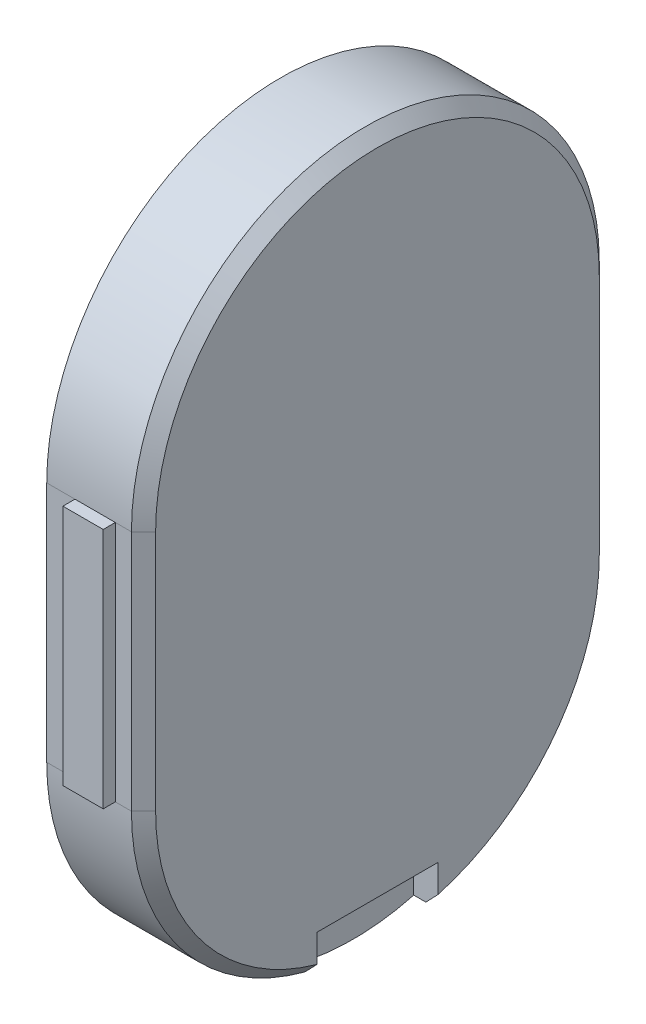
ISO-10303-21;
HEADER;
FILE_DESCRIPTION(('STEP AP214'),'2;1');
FILE_NAME('part.step','',(''),(''),'','','');
FILE_SCHEMA(('AUTOMOTIVE_DESIGN { 1 0 10303 214 1 1 1 1 }'));
ENDSEC;
DATA;
#1=APPLICATION_CONTEXT('core data for automotive mechanical design processes');
#2=APPLICATION_PROTOCOL_DEFINITION('international standard','automotive_design',2000,#1);
#3=PRODUCT_CONTEXT('',#1,'mechanical');
#4=PRODUCT('Part','Part','',(#3));
#5=PRODUCT_RELATED_PRODUCT_CATEGORY('part','',(#4));
#6=PRODUCT_DEFINITION_FORMATION('','',#4);
#7=PRODUCT_DEFINITION_CONTEXT('part definition',#1,'design');
#8=PRODUCT_DEFINITION('design','',#6,#7);
#9=PRODUCT_DEFINITION_SHAPE('','',#8);
#10=(LENGTH_UNIT() NAMED_UNIT(*) SI_UNIT(.MILLI.,.METRE.));
#11=(NAMED_UNIT(*) PLANE_ANGLE_UNIT() SI_UNIT($,.RADIAN.));
#12=(NAMED_UNIT(*) SI_UNIT($,.STERADIAN.) SOLID_ANGLE_UNIT());
#13=UNCERTAINTY_MEASURE_WITH_UNIT(LENGTH_MEASURE(1.E-05),#10,'distance_accuracy_value','');
#14=(GEOMETRIC_REPRESENTATION_CONTEXT(3) GLOBAL_UNCERTAINTY_ASSIGNED_CONTEXT((#13)) GLOBAL_UNIT_ASSIGNED_CONTEXT((#10,
#11,#12)) REPRESENTATION_CONTEXT('',''));
#15=CARTESIAN_POINT('',(0.,0.,0.));
#16=DIRECTION('',(0.,0.,1.));
#17=DIRECTION('',(1.,0.,0.));
#18=AXIS2_PLACEMENT_3D('',#15,#16,#17);
#19=CARTESIAN_POINT('',(63.,110.,67.4));
#20=DIRECTION('',(-1.,0.,0.));
#21=DIRECTION('',(0.,0.,1.));
#22=AXIS2_PLACEMENT_3D('',#19,#20,#21);
#23=CYLINDRICAL_SURFACE('',#22,5.8);
#24=DIRECTION('',(-1.,0.,0.));
#25=VECTOR('',#24,1.);
#26=CARTESIAN_POINT('',(63.,104.397322068867,68.9));
#27=LINE('',#26,#25);
#28=CARTESIAN_POINT('',(62.7,104.397322068867,68.9));
#29=VERTEX_POINT('',#28);
#30=CARTESIAN_POINT('',(62.4,104.397322068867,68.9));
#31=VERTEX_POINT('',#30);
#32=EDGE_CURVE('E205',#29,#31,#27,.T.);
#33=ORIENTED_EDGE('',*,*,#32,.F.);
#34=CARTESIAN_POINT('',(62.7,110.,67.4));
#35=DIRECTION('',(-1.,0.,0.));
#36=DIRECTION('',(0.,0.,1.));
#37=AXIS2_PLACEMENT_3D('',#34,#35,#36);
#38=CIRCLE('',#37,5.8);
#39=CARTESIAN_POINT('',(62.7,110.,73.2));
#40=VERTEX_POINT('',#39);
#41=EDGE_CURVE('E349',#29,#40,#38,.T.);
#42=ORIENTED_EDGE('',*,*,#41,.T.);
#43=DIRECTION('',(-1.,0.,0.));
#44=VECTOR('',#43,1.);
#45=CARTESIAN_POINT('',(63.,110.,73.2));
#46=LINE('',#45,#44);
#47=CARTESIAN_POINT('',(62.3,110.,73.2));
#48=VERTEX_POINT('',#47);
#49=EDGE_CURVE('E312',#40,#48,#46,.T.);
#50=ORIENTED_EDGE('',*,*,#49,.T.);
#51=CARTESIAN_POINT('',(61.3,110.,73.2));
#52=VERTEX_POINT('',#51);
#53=EDGE_CURVE('E317',#48,#52,#46,.T.);
#54=ORIENTED_EDGE('',*,*,#53,.T.);
#55=CARTESIAN_POINT('',(60.6,110.,73.2));
#56=VERTEX_POINT('',#55);
#57=EDGE_CURVE('E311',#52,#56,#46,.T.);
#58=ORIENTED_EDGE('',*,*,#57,.T.);
#59=CARTESIAN_POINT('',(60.6,110.,67.4));
#60=DIRECTION('',(1.,0.,0.));
#61=DIRECTION('',(0.,0.,1.));
#62=AXIS2_PLACEMENT_3D('',#59,#60,#61);
#63=CIRCLE('',#62,5.8);
#64=CARTESIAN_POINT('',(60.6,110.,61.6));
#65=VERTEX_POINT('',#64);
#66=EDGE_CURVE('E307',#56,#65,#63,.T.);
#67=ORIENTED_EDGE('',*,*,#66,.T.);
#68=DIRECTION('',(-1.,0.,0.));
#69=VECTOR('',#68,1.);
#70=CARTESIAN_POINT('',(63.,110.,61.6));
#71=LINE('',#70,#69);
#72=CARTESIAN_POINT('',(61.3,110.,61.6));
#73=VERTEX_POINT('',#72);
#74=EDGE_CURVE('E328',#73,#65,#71,.T.);
#75=ORIENTED_EDGE('',*,*,#74,.F.);
#76=CARTESIAN_POINT('',(62.3,110.,61.6));
#77=VERTEX_POINT('',#76);
#78=EDGE_CURVE('E335',#77,#73,#71,.T.);
#79=ORIENTED_EDGE('',*,*,#78,.F.);
#80=CARTESIAN_POINT('',(62.7,110.,61.6));
#81=VERTEX_POINT('',#80);
#82=EDGE_CURVE('E330',#81,#77,#71,.T.);
#83=ORIENTED_EDGE('',*,*,#82,.F.);
#84=CARTESIAN_POINT('',(62.7,104.397322068867,65.9));
#85=VERTEX_POINT('',#84);
#86=EDGE_CURVE('E350',#81,#85,#38,.T.);
#87=ORIENTED_EDGE('',*,*,#86,.T.);
#88=DIRECTION('',(-1.,0.,0.));
#89=VECTOR('',#88,1.);
#90=CARTESIAN_POINT('',(63.,104.397322068867,65.9));
#91=LINE('',#90,#89);
#92=CARTESIAN_POINT('',(62.4,104.397322068867,65.9));
#93=VERTEX_POINT('',#92);
#94=EDGE_CURVE('E66',#85,#93,#91,.T.);
#95=ORIENTED_EDGE('',*,*,#94,.T.);
#96=CARTESIAN_POINT('',(62.4,110.,67.4));
#97=DIRECTION('',(1.,0.,0.));
#98=DIRECTION('',(0.,0.,-1.));
#99=AXIS2_PLACEMENT_3D('',#96,#97,#98);
#100=CIRCLE('',#99,5.8);
#101=EDGE_CURVE('E11',#31,#93,#100,.T.);
#102=ORIENTED_EDGE('',*,*,#101,.F.);
#103=EDGE_LOOP('',(#33,#42,#50,#54,#58,#67,#75,#79,#83,#87,#95,#102));
#104=FACE_BOUND('',#103,.T.);
#105=ADVANCED_FACE('F49',(#104),#23,.T.);
#106=CARTESIAN_POINT('',(63.,110.,67.4));
#107=DIRECTION('',(-1.,0.,0.));
#108=DIRECTION('',(0.,0.,1.));
#109=AXIS2_PLACEMENT_3D('',#106,#107,#108);
#110=PLANE('',#109);
#111=DIRECTION('',(0.,-1.,0.));
#112=VECTOR('',#111,1.);
#113=CARTESIAN_POINT('',(63.,110.,68.9));
#114=LINE('',#113,#112);
#115=CARTESIAN_POINT('',(63.,105.4,68.9));
#116=VERTEX_POINT('',#115);
#117=CARTESIAN_POINT('',(63.,104.708497377871,68.9));
#118=VERTEX_POINT('',#117);
#119=EDGE_CURVE('E219',#116,#118,#114,.T.);
#120=ORIENTED_EDGE('',*,*,#119,.F.);
#121=DIRECTION('',(0.,0.,1.));
#122=VECTOR('',#121,1.);
#123=CARTESIAN_POINT('',(63.,105.4,67.4));
#124=LINE('',#123,#122);
#125=CARTESIAN_POINT('',(63.,105.4,65.9));
#126=VERTEX_POINT('',#125);
#127=EDGE_CURVE('E59',#126,#116,#124,.T.);
#128=ORIENTED_EDGE('',*,*,#127,.F.);
#129=DIRECTION('',(0.,-1.,0.));
#130=VECTOR('',#129,1.);
#131=CARTESIAN_POINT('',(63.,110.,65.9));
#132=LINE('',#131,#130);
#133=CARTESIAN_POINT('',(63.,104.708497377871,65.9));
#134=VERTEX_POINT('',#133);
#135=EDGE_CURVE('E201',#126,#134,#132,.T.);
#136=ORIENTED_EDGE('',*,*,#135,.T.);
#137=CARTESIAN_POINT('',(63.,110.,67.4));
#138=DIRECTION('',(-1.,0.,0.));
#139=DIRECTION('',(0.,0.,1.));
#140=AXIS2_PLACEMENT_3D('',#137,#138,#139);
#141=CIRCLE('',#140,5.49999999999999);
#142=CARTESIAN_POINT('',(63.,110.,61.9));
#143=VERTEX_POINT('',#142);
#144=EDGE_CURVE('E344',#134,#143,#141,.F.);
#145=ORIENTED_EDGE('',*,*,#144,.T.);
#146=DIRECTION('',(0.,1.,0.));
#147=VECTOR('',#146,1.);
#148=CARTESIAN_POINT('',(63.,110.,61.9));
#149=LINE('',#148,#147);
#150=CARTESIAN_POINT('',(63.,116.,61.9));
#151=VERTEX_POINT('',#150);
#152=EDGE_CURVE('E341',#143,#151,#149,.T.);
#153=ORIENTED_EDGE('',*,*,#152,.T.);
#154=CARTESIAN_POINT('',(63.,116.,67.4));
#155=DIRECTION('',(-1.,0.,0.));
#156=DIRECTION('',(0.,0.,1.));
#157=AXIS2_PLACEMENT_3D('',#154,#155,#156);
#158=CIRCLE('',#157,5.49999999999999);
#159=CARTESIAN_POINT('',(63.,116.,72.9));
#160=VERTEX_POINT('',#159);
#161=EDGE_CURVE('E334',#151,#160,#158,.F.);
#162=ORIENTED_EDGE('',*,*,#161,.T.);
#163=DIRECTION('',(0.,-1.,0.));
#164=VECTOR('',#163,1.);
#165=CARTESIAN_POINT('',(63.,110.,72.9));
#166=LINE('',#165,#164);
#167=CARTESIAN_POINT('',(63.,110.,72.9));
#168=VERTEX_POINT('',#167);
#169=EDGE_CURVE('E338',#160,#168,#166,.T.);
#170=ORIENTED_EDGE('',*,*,#169,.T.);
#171=EDGE_CURVE('E345',#168,#118,#141,.F.);
#172=ORIENTED_EDGE('',*,*,#171,.T.);
#173=EDGE_LOOP('',(#120,#128,#136,#145,#153,#162,#170,#172));
#174=FACE_BOUND('',#173,.T.);
#175=ADVANCED_FACE('F445',(#174),#110,.F.);
#176=CARTESIAN_POINT('',(63.,110.,67.4));
#177=DIRECTION('',(-1.,0.,0.));
#178=DIRECTION('',(0.,0.,1.));
#179=AXIS2_PLACEMENT_3D('',#176,#177,#178);
#180=CONICAL_SURFACE('',#179,5.49999999999999,0.785398163397448);
#181=ORIENTED_EDGE('',*,*,#41,.F.);
#182=CARTESIAN_POINT('',(61.4628683123147,103.124592929155,68.9));
#183=CARTESIAN_POINT('',(61.6959494424737,103.363197804304,68.9));
#184=CARTESIAN_POINT('',(61.9287883147822,103.602040927902,68.9));
#185=CARTESIAN_POINT('',(62.3936696597395,104.080488885385,68.9));
#186=CARTESIAN_POINT('',(62.6257121524155,104.320093699818,68.9));
#187=CARTESIAN_POINT('',(63.0887046335069,104.800366398064,68.9));
#188=CARTESIAN_POINT('',(63.3196546032696,105.041034299892,68.9));
#189=CARTESIAN_POINT('',(63.6648267390506,105.403236485253,68.9));
#190=CARTESIAN_POINT('',(63.7796767548246,105.524172135007,68.9));
#191=CARTESIAN_POINT('',(64.0088383775944,105.766553873108,68.9));
#192=CARTESIAN_POINT('',(64.1231499809189,105.887999964926,68.9));
#193=CARTESIAN_POINT('',(64.2371316876853,106.00975611671,68.9));
#194=B_SPLINE_CURVE_WITH_KNOTS('',3,(#182,#183,#184,#185,#186,#187,#188,#189,#190,#191,#192,
#193),.UNSPECIFIED.,.F.,.F.,(4,2,2,2,2,4),(0.,1.00066718336188,2.00130901489094,
3.00196786925576,3.50230991491606,4.00265536751893),.UNSPECIFIED.);
#195=EDGE_CURVE('E386',#29,#118,#194,.T.);
#196=ORIENTED_EDGE('',*,*,#195,.T.);
#197=ORIENTED_EDGE('',*,*,#171,.F.);
#198=DIRECTION('',(-0.707106781186547,0.,0.707106781186547));
#199=VECTOR('',#198,1.);
#200=CARTESIAN_POINT('',(63.,110.,72.9));
#201=LINE('',#200,#199);
#202=EDGE_CURVE('E367',#168,#40,#201,.T.);
#203=ORIENTED_EDGE('',*,*,#202,.T.);
#204=EDGE_LOOP('',(#181,#196,#197,#203));
#205=FACE_BOUND('',#204,.T.);
#206=ADVANCED_FACE('F448',(#205),#180,.T.);
#207=CARTESIAN_POINT('',(63.,110.,73.2));
#208=DIRECTION('',(0.,0.,-1.));
#209=DIRECTION('',(-1.,0.,0.));
#210=AXIS2_PLACEMENT_3D('',#207,#208,#209);
#211=PLANE('',#210);
#212=DIRECTION('',(0.,-1.,0.));
#213=VECTOR('',#212,1.);
#214=CARTESIAN_POINT('',(61.3,110.,73.2));
#215=LINE('',#214,#213);
#216=CARTESIAN_POINT('',(61.3,116.,73.2));
#217=VERTEX_POINT('',#216);
#218=EDGE_CURVE('E254',#217,#52,#215,.T.);
#219=ORIENTED_EDGE('',*,*,#218,.F.);
#220=DIRECTION('',(-1.,0.,0.));
#221=VECTOR('',#220,1.);
#222=CARTESIAN_POINT('',(63.,116.,73.2));
#223=LINE('',#222,#221);
#224=CARTESIAN_POINT('',(60.6,116.,73.2));
#225=VERTEX_POINT('',#224);
#226=EDGE_CURVE('E316',#217,#225,#223,.T.);
#227=ORIENTED_EDGE('',*,*,#226,.T.);
#228=DIRECTION('',(0.,-1.,0.));
#229=VECTOR('',#228,1.);
#230=CARTESIAN_POINT('',(60.6,110.,73.2));
#231=LINE('',#230,#229);
#232=EDGE_CURVE('E303',#225,#56,#231,.T.);
#233=ORIENTED_EDGE('',*,*,#232,.T.);
#234=ORIENTED_EDGE('',*,*,#57,.F.);
#235=EDGE_LOOP('',(#219,#227,#233,#234));
#236=FACE_BOUND('',#235,.T.);
#237=ADVANCED_FACE('F458',(#236),#211,.F.);
#238=DIRECTION('',(0.,1.,0.));
#239=VECTOR('',#238,1.);
#240=CARTESIAN_POINT('',(62.3,110.,73.2));
#241=LINE('',#240,#239);
#242=CARTESIAN_POINT('',(62.3,116.,73.2));
#243=VERTEX_POINT('',#242);
#244=EDGE_CURVE('E251',#48,#243,#241,.T.);
#245=ORIENTED_EDGE('',*,*,#244,.F.);
#246=ORIENTED_EDGE('',*,*,#49,.F.);
#247=DIRECTION('',(0.,1.,0.));
#248=VECTOR('',#247,1.);
#249=CARTESIAN_POINT('',(62.7,110.,73.2));
#250=LINE('',#249,#248);
#251=CARTESIAN_POINT('',(62.7,116.,73.2));
#252=VERTEX_POINT('',#251);
#253=EDGE_CURVE('E357',#40,#252,#250,.T.);
#254=ORIENTED_EDGE('',*,*,#253,.T.);
#255=EDGE_CURVE('E318',#252,#243,#223,.T.);
#256=ORIENTED_EDGE('',*,*,#255,.T.);
#257=EDGE_LOOP('',(#245,#246,#254,#256));
#258=FACE_BOUND('',#257,.T.);
#259=ADVANCED_FACE('F461',(#258),#211,.F.);
#260=CARTESIAN_POINT('',(63.,116.,61.6));
#261=DIRECTION('',(0.,0.,1.));
#262=DIRECTION('',(1.,0.,0.));
#263=AXIS2_PLACEMENT_3D('',#260,#261,#262);
#264=PLANE('',#263);
#265=DIRECTION('',(0.,1.,0.));
#266=VECTOR('',#265,1.);
#267=CARTESIAN_POINT('',(61.3,116.,61.6));
#268=LINE('',#267,#266);
#269=CARTESIAN_POINT('',(61.3,116.,61.6));
#270=VERTEX_POINT('',#269);
#271=EDGE_CURVE('E289',#73,#270,#268,.T.);
#272=ORIENTED_EDGE('',*,*,#271,.F.);
#273=ORIENTED_EDGE('',*,*,#74,.T.);
#274=DIRECTION('',(0.,1.,0.));
#275=VECTOR('',#274,1.);
#276=CARTESIAN_POINT('',(60.6,116.,61.6));
#277=LINE('',#276,#275);
#278=CARTESIAN_POINT('',(60.6,116.,61.6));
#279=VERTEX_POINT('',#278);
#280=EDGE_CURVE('E294',#65,#279,#277,.T.);
#281=ORIENTED_EDGE('',*,*,#280,.T.);
#282=DIRECTION('',(-1.,0.,0.));
#283=VECTOR('',#282,1.);
#284=CARTESIAN_POINT('',(63.,116.,61.6));
#285=LINE('',#284,#283);
#286=EDGE_CURVE('E322',#270,#279,#285,.T.);
#287=ORIENTED_EDGE('',*,*,#286,.F.);
#288=EDGE_LOOP('',(#272,#273,#281,#287));
#289=FACE_BOUND('',#288,.T.);
#290=ADVANCED_FACE('F466',(#289),#264,.F.);
#291=DIRECTION('',(0.,-1.,0.));
#292=VECTOR('',#291,1.);
#293=CARTESIAN_POINT('',(62.3,116.,61.6));
#294=LINE('',#293,#292);
#295=CARTESIAN_POINT('',(62.3,116.,61.6));
#296=VERTEX_POINT('',#295);
#297=EDGE_CURVE('E285',#296,#77,#294,.T.);
#298=ORIENTED_EDGE('',*,*,#297,.F.);
#299=CARTESIAN_POINT('',(62.7,116.,61.6));
#300=VERTEX_POINT('',#299);
#301=EDGE_CURVE('E324',#300,#296,#285,.T.);
#302=ORIENTED_EDGE('',*,*,#301,.F.);
#303=DIRECTION('',(0.,-1.,0.));
#304=VECTOR('',#303,1.);
#305=CARTESIAN_POINT('',(62.7,116.,61.6));
#306=LINE('',#305,#304);
#307=EDGE_CURVE('E354',#300,#81,#306,.T.);
#308=ORIENTED_EDGE('',*,*,#307,.T.);
#309=ORIENTED_EDGE('',*,*,#82,.T.);
#310=EDGE_LOOP('',(#298,#302,#308,#309));
#311=FACE_BOUND('',#310,.T.);
#312=ADVANCED_FACE('F464',(#311),#264,.F.);
#313=CARTESIAN_POINT('',(63.,116.,67.4));
#314=DIRECTION('',(-1.,0.,0.));
#315=DIRECTION('',(0.,0.,1.));
#316=AXIS2_PLACEMENT_3D('',#313,#314,#315);
#317=CYLINDRICAL_SURFACE('',#316,5.8);
#318=ORIENTED_EDGE('',*,*,#255,.F.);
#319=CARTESIAN_POINT('',(62.7,116.,67.4));
#320=DIRECTION('',(-1.,0.,0.));
#321=DIRECTION('',(0.,0.,1.));
#322=AXIS2_PLACEMENT_3D('',#319,#320,#321);
#323=CIRCLE('',#322,5.8);
#324=EDGE_CURVE('E360',#252,#300,#323,.T.);
#325=ORIENTED_EDGE('',*,*,#324,.T.);
#326=ORIENTED_EDGE('',*,*,#301,.T.);
#327=EDGE_CURVE('E329',#296,#270,#285,.T.);
#328=ORIENTED_EDGE('',*,*,#327,.T.);
#329=ORIENTED_EDGE('',*,*,#286,.T.);
#330=CARTESIAN_POINT('',(60.6,116.,67.4));
#331=DIRECTION('',(1.,0.,0.));
#332=DIRECTION('',(0.,0.,1.));
#333=AXIS2_PLACEMENT_3D('',#330,#331,#332);
#334=CIRCLE('',#333,5.8);
#335=EDGE_CURVE('E298',#279,#225,#334,.T.);
#336=ORIENTED_EDGE('',*,*,#335,.T.);
#337=ORIENTED_EDGE('',*,*,#226,.F.);
#338=EDGE_CURVE('E323',#243,#217,#223,.T.);
#339=ORIENTED_EDGE('',*,*,#338,.F.);
#340=EDGE_LOOP('',(#318,#325,#326,#328,#329,#336,#337,#339));
#341=FACE_BOUND('',#340,.T.);
#342=ADVANCED_FACE('F453',(#341),#317,.T.);
#343=CARTESIAN_POINT('',(60.6,110.,67.4));
#344=DIRECTION('',(-1.,0.,0.));
#345=DIRECTION('',(0.,0.,1.));
#346=AXIS2_PLACEMENT_3D('',#343,#344,#345);
#347=PLANE('',#346);
#348=ORIENTED_EDGE('',*,*,#280,.F.);
#349=ORIENTED_EDGE('',*,*,#66,.F.);
#350=ORIENTED_EDGE('',*,*,#232,.F.);
#351=ORIENTED_EDGE('',*,*,#335,.F.);
#352=EDGE_LOOP('',(#348,#349,#350,#351));
#353=FACE_BOUND('',#352,.T.);
#354=ADVANCED_FACE('F450',(#353),#347,.T.);
#355=CARTESIAN_POINT('',(63.,116.,67.4));
#356=DIRECTION('',(-1.,0.,0.));
#357=DIRECTION('',(0.,0.,1.));
#358=AXIS2_PLACEMENT_3D('',#355,#356,#357);
#359=CONICAL_SURFACE('',#358,5.49999999999999,0.785398163397448);
#360=DIRECTION('',(0.707106781186547,0.,0.707106781186547));
#361=VECTOR('',#360,1.);
#362=CARTESIAN_POINT('',(62.7,116.,61.6));
#363=LINE('',#362,#361);
#364=EDGE_CURVE('E371',#300,#151,#363,.T.);
#365=ORIENTED_EDGE('',*,*,#364,.F.);
#366=ORIENTED_EDGE('',*,*,#324,.F.);
#367=DIRECTION('',(-0.707106781186547,0.,0.707106781186547));
#368=VECTOR('',#367,1.);
#369=CARTESIAN_POINT('',(63.,116.,72.9));
#370=LINE('',#369,#368);
#371=EDGE_CURVE('E299',#160,#252,#370,.T.);
#372=ORIENTED_EDGE('',*,*,#371,.F.);
#373=ORIENTED_EDGE('',*,*,#161,.F.);
#374=EDGE_LOOP('',(#365,#366,#372,#373));
#375=FACE_BOUND('',#374,.T.);
#376=ADVANCED_FACE('F52',(#375),#359,.T.);
#377=CARTESIAN_POINT('',(63.,110.,72.9));
#378=DIRECTION('',(-0.707106781186547,0.,-0.707106781186547));
#379=DIRECTION('',(0.,-1.,0.));
#380=AXIS2_PLACEMENT_3D('',#377,#378,#379);
#381=PLANE('',#380);
#382=ORIENTED_EDGE('',*,*,#371,.T.);
#383=ORIENTED_EDGE('',*,*,#253,.F.);
#384=ORIENTED_EDGE('',*,*,#202,.F.);
#385=ORIENTED_EDGE('',*,*,#169,.F.);
#386=EDGE_LOOP('',(#382,#383,#384,#385));
#387=FACE_BOUND('',#386,.T.);
#388=ADVANCED_FACE('F526',(#387),#381,.F.);
#389=CARTESIAN_POINT('',(63.,110.,61.9));
#390=DIRECTION('',(-0.707106781186547,0.,0.707106781186547));
#391=DIRECTION('',(0.,1.,0.));
#392=AXIS2_PLACEMENT_3D('',#389,#390,#391);
#393=PLANE('',#392);
#394=ORIENTED_EDGE('',*,*,#364,.T.);
#395=ORIENTED_EDGE('',*,*,#152,.F.);
#396=DIRECTION('',(0.707106781186547,0.,0.707106781186547));
#397=VECTOR('',#396,1.);
#398=CARTESIAN_POINT('',(62.7,110.,61.6));
#399=LINE('',#398,#397);
#400=EDGE_CURVE('E293',#81,#143,#399,.T.);
#401=ORIENTED_EDGE('',*,*,#400,.F.);
#402=ORIENTED_EDGE('',*,*,#307,.F.);
#403=EDGE_LOOP('',(#394,#395,#401,#402));
#404=FACE_BOUND('',#403,.T.);
#405=ADVANCED_FACE('F534',(#404),#393,.F.);
#406=CARTESIAN_POINT('',(61.4628683123147,103.124592929155,65.9));
#407=CARTESIAN_POINT('',(61.6959494424737,103.363197804304,65.9));
#408=CARTESIAN_POINT('',(61.9287883147822,103.602040927902,65.9));
#409=CARTESIAN_POINT('',(62.3936696597395,104.080488885385,65.9));
#410=CARTESIAN_POINT('',(62.6257121524155,104.320093699818,65.9));
#411=CARTESIAN_POINT('',(63.0887046335069,104.800366398064,65.9));
#412=CARTESIAN_POINT('',(63.3196546032696,105.041034299892,65.9));
#413=CARTESIAN_POINT('',(63.6648267390506,105.403236485253,65.9));
#414=CARTESIAN_POINT('',(63.7796767548246,105.524172135007,65.9));
#415=CARTESIAN_POINT('',(64.0088383775944,105.766553873108,65.9));
#416=CARTESIAN_POINT('',(64.1231499809189,105.887999964926,65.9));
#417=CARTESIAN_POINT('',(64.2371316876853,106.00975611671,65.9));
#418=B_SPLINE_CURVE_WITH_KNOTS('',3,(#406,#407,#408,#409,#410,#411,#412,#413,#414,#415,#416,
#417),.UNSPECIFIED.,.F.,.F.,(4,2,2,2,2,4),(0.,1.00066718336188,2.00130901489094,
3.00196786925576,3.50230991491606,4.00265536751893),.UNSPECIFIED.);
#419=EDGE_CURVE('E363',#85,#134,#418,.T.);
#420=ORIENTED_EDGE('',*,*,#419,.F.);
#421=ORIENTED_EDGE('',*,*,#86,.F.);
#422=ORIENTED_EDGE('',*,*,#400,.T.);
#423=ORIENTED_EDGE('',*,*,#144,.F.);
#424=EDGE_LOOP('',(#420,#421,#422,#423));
#425=FACE_BOUND('',#424,.T.);
#426=ADVANCED_FACE('F393',(#425),#180,.T.);
#427=CARTESIAN_POINT('',(61.3,116.,61.61));
#428=DIRECTION('',(0.,-1.,0.));
#429=DIRECTION('',(0.,0.,-1.));
#430=AXIS2_PLACEMENT_3D('',#427,#428,#429);
#431=PLANE('',#430);
#432=DIRECTION('',(0.,0.,-1.));
#433=VECTOR('',#432,1.);
#434=CARTESIAN_POINT('',(61.3,116.,61.61));
#435=LINE('',#434,#433);
#436=CARTESIAN_POINT('',(61.3,116.,61.3));
#437=VERTEX_POINT('',#436);
#438=EDGE_CURVE('E273',#270,#437,#435,.T.);
#439=ORIENTED_EDGE('',*,*,#438,.F.);
#440=ORIENTED_EDGE('',*,*,#327,.F.);
#441=DIRECTION('',(0.,0.,-1.));
#442=VECTOR('',#441,1.);
#443=CARTESIAN_POINT('',(62.3,116.,61.61));
#444=LINE('',#443,#442);
#445=CARTESIAN_POINT('',(62.3,116.,61.3));
#446=VERTEX_POINT('',#445);
#447=EDGE_CURVE('E276',#296,#446,#444,.T.);
#448=ORIENTED_EDGE('',*,*,#447,.T.);
#449=DIRECTION('',(-1.,0.,0.));
#450=VECTOR('',#449,1.);
#451=CARTESIAN_POINT('',(61.3,116.,61.3));
#452=LINE('',#451,#450);
#453=EDGE_CURVE('E269',#446,#437,#452,.T.);
#454=ORIENTED_EDGE('',*,*,#453,.T.);
#455=EDGE_LOOP('',(#439,#440,#448,#454));
#456=FACE_BOUND('',#455,.T.);
#457=ADVANCED_FACE('F430',(#456),#431,.F.);
#458=CARTESIAN_POINT('',(61.3,110.,61.61));
#459=DIRECTION('',(0.,1.,0.));
#460=DIRECTION('',(0.,0.,1.));
#461=AXIS2_PLACEMENT_3D('',#458,#459,#460);
#462=PLANE('',#461);
#463=DIRECTION('',(0.,0.,-1.));
#464=VECTOR('',#463,1.);
#465=CARTESIAN_POINT('',(62.3,110.,61.61));
#466=LINE('',#465,#464);
#467=CARTESIAN_POINT('',(62.3,110.,61.3));
#468=VERTEX_POINT('',#467);
#469=EDGE_CURVE('E279',#77,#468,#466,.T.);
#470=ORIENTED_EDGE('',*,*,#469,.F.);
#471=ORIENTED_EDGE('',*,*,#78,.T.);
#472=DIRECTION('',(0.,0.,-1.));
#473=VECTOR('',#472,1.);
#474=CARTESIAN_POINT('',(61.3,110.,61.61));
#475=LINE('',#474,#473);
#476=CARTESIAN_POINT('',(61.3,110.,61.3));
#477=VERTEX_POINT('',#476);
#478=EDGE_CURVE('E282',#73,#477,#475,.T.);
#479=ORIENTED_EDGE('',*,*,#478,.T.);
#480=DIRECTION('',(1.,0.,0.));
#481=VECTOR('',#480,1.);
#482=CARTESIAN_POINT('',(61.3,110.,61.3));
#483=LINE('',#482,#481);
#484=EDGE_CURVE('E261',#477,#468,#483,.T.);
#485=ORIENTED_EDGE('',*,*,#484,.T.);
#486=EDGE_LOOP('',(#470,#471,#479,#485));
#487=FACE_BOUND('',#486,.T.);
#488=ADVANCED_FACE('F433',(#487),#462,.F.);
#489=CARTESIAN_POINT('',(61.3,110.,61.61));
#490=DIRECTION('',(1.,0.,0.));
#491=DIRECTION('',(0.,0.,-1.));
#492=AXIS2_PLACEMENT_3D('',#489,#490,#491);
#493=PLANE('',#492);
#494=ORIENTED_EDGE('',*,*,#478,.F.);
#495=ORIENTED_EDGE('',*,*,#271,.T.);
#496=ORIENTED_EDGE('',*,*,#438,.T.);
#497=DIRECTION('',(0.,-1.,0.));
#498=VECTOR('',#497,1.);
#499=CARTESIAN_POINT('',(61.3,110.,61.3));
#500=LINE('',#499,#498);
#501=EDGE_CURVE('E257',#437,#477,#500,.T.);
#502=ORIENTED_EDGE('',*,*,#501,.T.);
#503=EDGE_LOOP('',(#494,#495,#496,#502));
#504=FACE_BOUND('',#503,.T.);
#505=ADVANCED_FACE('F437',(#504),#493,.F.);
#506=CARTESIAN_POINT('',(62.3,110.,61.61));
#507=DIRECTION('',(-1.,0.,0.));
#508=DIRECTION('',(0.,0.,1.));
#509=AXIS2_PLACEMENT_3D('',#506,#507,#508);
#510=PLANE('',#509);
#511=ORIENTED_EDGE('',*,*,#447,.F.);
#512=ORIENTED_EDGE('',*,*,#297,.T.);
#513=ORIENTED_EDGE('',*,*,#469,.T.);
#514=DIRECTION('',(0.,1.,0.));
#515=VECTOR('',#514,1.);
#516=CARTESIAN_POINT('',(62.3,110.,61.3));
#517=LINE('',#516,#515);
#518=EDGE_CURVE('E265',#468,#446,#517,.T.);
#519=ORIENTED_EDGE('',*,*,#518,.T.);
#520=EDGE_LOOP('',(#511,#512,#513,#519));
#521=FACE_BOUND('',#520,.T.);
#522=ADVANCED_FACE('F428',(#521),#510,.F.);
#523=CARTESIAN_POINT('',(0.,0.,61.3));
#524=DIRECTION('',(0.,0.,-1.));
#525=DIRECTION('',(-1.,0.,0.));
#526=AXIS2_PLACEMENT_3D('',#523,#524,#525);
#527=PLANE('',#526);
#528=ORIENTED_EDGE('',*,*,#501,.F.);
#529=ORIENTED_EDGE('',*,*,#453,.F.);
#530=ORIENTED_EDGE('',*,*,#518,.F.);
#531=ORIENTED_EDGE('',*,*,#484,.F.);
#532=EDGE_LOOP('',(#528,#529,#530,#531));
#533=FACE_BOUND('',#532,.T.);
#534=ADVANCED_FACE('F415',(#533),#527,.T.);
#535=CARTESIAN_POINT('',(61.3,116.,73.5));
#536=DIRECTION('',(0.,-1.,0.));
#537=DIRECTION('',(0.,0.,-1.));
#538=AXIS2_PLACEMENT_3D('',#535,#536,#537);
#539=PLANE('',#538);
#540=DIRECTION('',(0.,0.,-1.));
#541=VECTOR('',#540,1.);
#542=CARTESIAN_POINT('',(62.3,116.,73.5));
#543=LINE('',#542,#541);
#544=CARTESIAN_POINT('',(62.3,116.,73.5));
#545=VERTEX_POINT('',#544);
#546=EDGE_CURVE('E241',#545,#243,#543,.T.);
#547=ORIENTED_EDGE('',*,*,#546,.T.);
#548=ORIENTED_EDGE('',*,*,#338,.T.);
#549=DIRECTION('',(0.,0.,-1.));
#550=VECTOR('',#549,1.);
#551=CARTESIAN_POINT('',(61.3,116.,73.5));
#552=LINE('',#551,#550);
#553=CARTESIAN_POINT('',(61.3,116.,73.5));
#554=VERTEX_POINT('',#553);
#555=EDGE_CURVE('E237',#554,#217,#552,.T.);
#556=ORIENTED_EDGE('',*,*,#555,.F.);
#557=DIRECTION('',(-1.,0.,0.));
#558=VECTOR('',#557,1.);
#559=CARTESIAN_POINT('',(61.3,116.,73.5));
#560=LINE('',#559,#558);
#561=EDGE_CURVE('E234',#545,#554,#560,.T.);
#562=ORIENTED_EDGE('',*,*,#561,.F.);
#563=EDGE_LOOP('',(#547,#548,#556,#562));
#564=FACE_BOUND('',#563,.T.);
#565=ADVANCED_FACE('F411',(#564),#539,.F.);
#566=CARTESIAN_POINT('',(61.3,110.,73.5));
#567=DIRECTION('',(0.,1.,0.));
#568=DIRECTION('',(0.,0.,1.));
#569=AXIS2_PLACEMENT_3D('',#566,#567,#568);
#570=PLANE('',#569);
#571=DIRECTION('',(0.,0.,-1.));
#572=VECTOR('',#571,1.);
#573=CARTESIAN_POINT('',(61.3,110.,73.5));
#574=LINE('',#573,#572);
#575=CARTESIAN_POINT('',(61.3,110.,73.5));
#576=VERTEX_POINT('',#575);
#577=EDGE_CURVE('E74',#576,#52,#574,.T.);
#578=ORIENTED_EDGE('',*,*,#577,.T.);
#579=ORIENTED_EDGE('',*,*,#53,.F.);
#580=DIRECTION('',(0.,0.,-1.));
#581=VECTOR('',#580,1.);
#582=CARTESIAN_POINT('',(62.3,110.,73.5));
#583=LINE('',#582,#581);
#584=CARTESIAN_POINT('',(62.3,110.,73.5));
#585=VERTEX_POINT('',#584);
#586=EDGE_CURVE('E245',#585,#48,#583,.T.);
#587=ORIENTED_EDGE('',*,*,#586,.F.);
#588=DIRECTION('',(1.,0.,0.));
#589=VECTOR('',#588,1.);
#590=CARTESIAN_POINT('',(61.3,110.,73.5));
#591=LINE('',#590,#589);
#592=EDGE_CURVE('E228',#576,#585,#591,.T.);
#593=ORIENTED_EDGE('',*,*,#592,.F.);
#594=EDGE_LOOP('',(#578,#579,#587,#593));
#595=FACE_BOUND('',#594,.T.);
#596=ADVANCED_FACE('F414',(#595),#570,.F.);
#597=CARTESIAN_POINT('',(61.3,110.,73.5));
#598=DIRECTION('',(1.,0.,0.));
#599=DIRECTION('',(0.,0.,-1.));
#600=AXIS2_PLACEMENT_3D('',#597,#598,#599);
#601=PLANE('',#600);
#602=ORIENTED_EDGE('',*,*,#555,.T.);
#603=ORIENTED_EDGE('',*,*,#218,.T.);
#604=ORIENTED_EDGE('',*,*,#577,.F.);
#605=DIRECTION('',(0.,-1.,0.));
#606=VECTOR('',#605,1.);
#607=CARTESIAN_POINT('',(61.3,110.,73.5));
#608=LINE('',#607,#606);
#609=EDGE_CURVE('E224',#554,#576,#608,.T.);
#610=ORIENTED_EDGE('',*,*,#609,.F.);
#611=EDGE_LOOP('',(#602,#603,#604,#610));
#612=FACE_BOUND('',#611,.T.);
#613=ADVANCED_FACE('F419',(#612),#601,.F.);
#614=CARTESIAN_POINT('',(62.3,110.,73.5));
#615=DIRECTION('',(-1.,0.,0.));
#616=DIRECTION('',(0.,0.,1.));
#617=AXIS2_PLACEMENT_3D('',#614,#615,#616);
#618=PLANE('',#617);
#619=ORIENTED_EDGE('',*,*,#586,.T.);
#620=ORIENTED_EDGE('',*,*,#244,.T.);
#621=ORIENTED_EDGE('',*,*,#546,.F.);
#622=DIRECTION('',(0.,1.,0.));
#623=VECTOR('',#622,1.);
#624=CARTESIAN_POINT('',(62.3,110.,73.5));
#625=LINE('',#624,#623);
#626=EDGE_CURVE('E231',#585,#545,#625,.T.);
#627=ORIENTED_EDGE('',*,*,#626,.F.);
#628=EDGE_LOOP('',(#619,#620,#621,#627));
#629=FACE_BOUND('',#628,.T.);
#630=ADVANCED_FACE('F409',(#629),#618,.F.);
#631=CARTESIAN_POINT('',(0.,0.,73.5));
#632=DIRECTION('',(0.,0.,-1.));
#633=DIRECTION('',(-1.,0.,0.));
#634=AXIS2_PLACEMENT_3D('',#631,#632,#633);
#635=PLANE('',#634);
#636=ORIENTED_EDGE('',*,*,#609,.T.);
#637=ORIENTED_EDGE('',*,*,#592,.T.);
#638=ORIENTED_EDGE('',*,*,#626,.T.);
#639=ORIENTED_EDGE('',*,*,#561,.T.);
#640=EDGE_LOOP('',(#636,#637,#638,#639));
#641=FACE_BOUND('',#640,.T.);
#642=ADVANCED_FACE('F406',(#641),#635,.F.);
#643=CARTESIAN_POINT('',(62.4,104.1,68.9));
#644=DIRECTION('',(1.,0.,0.));
#645=DIRECTION('',(0.,0.,-1.));
#646=AXIS2_PLACEMENT_3D('',#643,#644,#645);
#647=PLANE('',#646);
#648=ORIENTED_EDGE('',*,*,#101,.T.);
#649=DIRECTION('',(0.,-1.,0.));
#650=VECTOR('',#649,1.);
#651=CARTESIAN_POINT('',(62.4,104.1,65.9));
#652=LINE('',#651,#650);
#653=CARTESIAN_POINT('',(62.4,105.4,65.9));
#654=VERTEX_POINT('',#653);
#655=EDGE_CURVE('E199',#654,#93,#652,.T.);
#656=ORIENTED_EDGE('',*,*,#655,.F.);
#657=DIRECTION('',(0.,0.,-1.));
#658=VECTOR('',#657,1.);
#659=CARTESIAN_POINT('',(62.4,105.4,68.9));
#660=LINE('',#659,#658);
#661=CARTESIAN_POINT('',(62.4,105.4,68.9));
#662=VERTEX_POINT('',#661);
#663=EDGE_CURVE('E186',#662,#654,#660,.T.);
#664=ORIENTED_EDGE('',*,*,#663,.F.);
#665=DIRECTION('',(0.,-1.,0.));
#666=VECTOR('',#665,1.);
#667=CARTESIAN_POINT('',(62.4,104.1,68.9));
#668=LINE('',#667,#666);
#669=EDGE_CURVE('E193',#662,#31,#668,.T.);
#670=ORIENTED_EDGE('',*,*,#669,.T.);
#671=EDGE_LOOP('',(#648,#656,#664,#670));
#672=FACE_BOUND('',#671,.T.);
#673=ADVANCED_FACE('F197',(#672),#647,.T.);
#674=CARTESIAN_POINT('',(62.4,105.4,68.9));
#675=DIRECTION('',(0.,-1.,0.));
#676=DIRECTION('',(0.,0.,-1.));
#677=AXIS2_PLACEMENT_3D('',#674,#675,#676);
#678=PLANE('',#677);
#679=ORIENTED_EDGE('',*,*,#127,.T.);
#680=DIRECTION('',(-1.,0.,0.));
#681=VECTOR('',#680,1.);
#682=CARTESIAN_POINT('',(62.4,105.4,68.9));
#683=LINE('',#682,#681);
#684=EDGE_CURVE('E182',#116,#662,#683,.T.);
#685=ORIENTED_EDGE('',*,*,#684,.T.);
#686=ORIENTED_EDGE('',*,*,#663,.T.);
#687=DIRECTION('',(-1.,0.,0.));
#688=VECTOR('',#687,1.);
#689=CARTESIAN_POINT('',(62.4,105.4,65.9));
#690=LINE('',#689,#688);
#691=EDGE_CURVE('E207',#126,#654,#690,.T.);
#692=ORIENTED_EDGE('',*,*,#691,.F.);
#693=EDGE_LOOP('',(#679,#685,#686,#692));
#694=FACE_BOUND('',#693,.T.);
#695=ADVANCED_FACE('F184',(#694),#678,.T.);
#696=CARTESIAN_POINT('',(0.,0.,68.9));
#697=DIRECTION('',(0.,0.,-1.));
#698=DIRECTION('',(-1.,0.,0.));
#699=AXIS2_PLACEMENT_3D('',#696,#697,#698);
#700=PLANE('',#699);
#701=ORIENTED_EDGE('',*,*,#32,.T.);
#702=ORIENTED_EDGE('',*,*,#669,.F.);
#703=ORIENTED_EDGE('',*,*,#684,.F.);
#704=ORIENTED_EDGE('',*,*,#119,.T.);
#705=ORIENTED_EDGE('',*,*,#195,.F.);
#706=EDGE_LOOP('',(#701,#702,#703,#704,#705));
#707=FACE_BOUND('',#706,.T.);
#708=ADVANCED_FACE('F203',(#707),#700,.T.);
#709=CARTESIAN_POINT('',(0.,0.,65.9));
#710=DIRECTION('',(0.,0.,-1.));
#711=DIRECTION('',(-1.,0.,0.));
#712=AXIS2_PLACEMENT_3D('',#709,#710,#711);
#713=PLANE('',#712);
#714=ORIENTED_EDGE('',*,*,#419,.T.);
#715=ORIENTED_EDGE('',*,*,#135,.F.);
#716=ORIENTED_EDGE('',*,*,#691,.T.);
#717=ORIENTED_EDGE('',*,*,#655,.T.);
#718=ORIENTED_EDGE('',*,*,#94,.F.);
#719=EDGE_LOOP('',(#714,#715,#716,#717,#718));
#720=FACE_BOUND('',#719,.T.);
#721=ADVANCED_FACE('F397',(#720),#713,.F.);
#722=CLOSED_SHELL('',(#105,#175,#206,#237,#259,#290,#312,#342,#354,#376,#388,#405,#426,#457,
#488,#505,#522,#534,#565,#596,#613,#630,#642,#673,#695,#708,#721));
#723=MANIFOLD_SOLID_BREP('B2',#722);
#724=ADVANCED_BREP_SHAPE_REPRESENTATION('',(#18,#723),#14);
#725=SHAPE_DEFINITION_REPRESENTATION(#9,#724);
ENDSEC;
END-ISO-10303-21;
